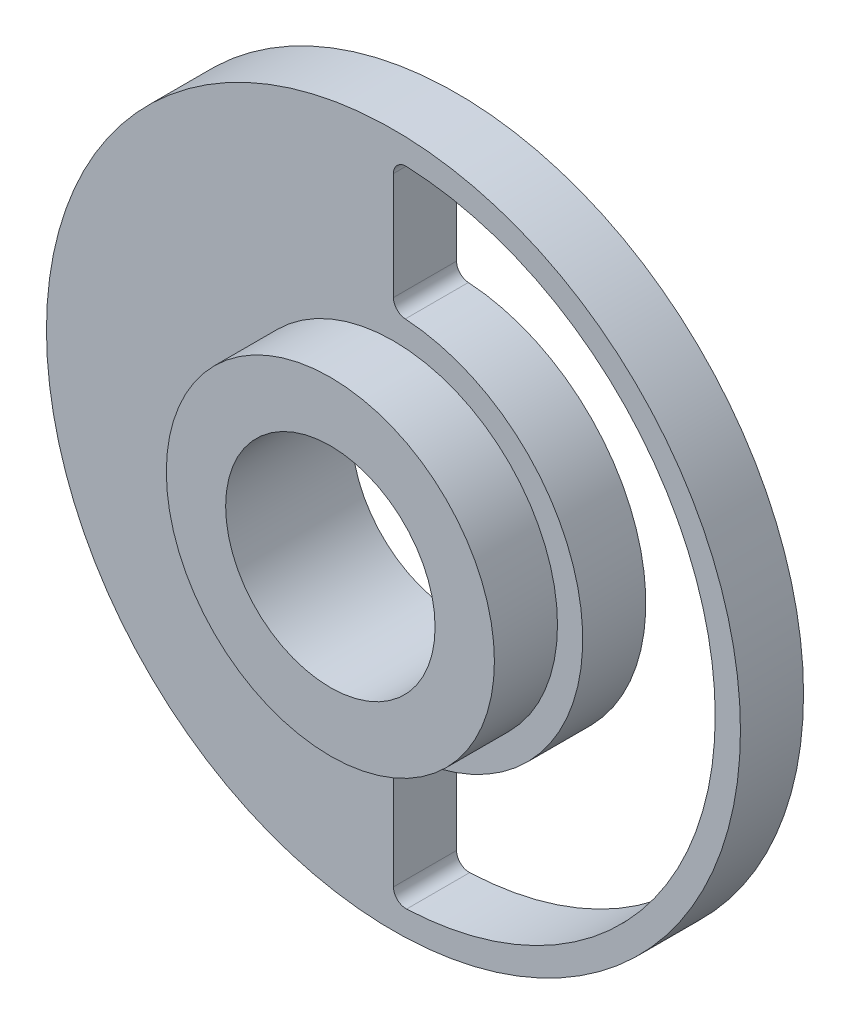
ISO-10303-21;
HEADER;
FILE_DESCRIPTION(('STEP AP214'),'2;1');
FILE_NAME('part.step','',(''),(''),'','','');
FILE_SCHEMA(('AUTOMOTIVE_DESIGN { 1 0 10303 214 1 1 1 1 }'));
ENDSEC;
DATA;
#1=APPLICATION_CONTEXT('core data for automotive mechanical design processes');
#2=APPLICATION_PROTOCOL_DEFINITION('international standard','automotive_design',2000,#1);
#3=PRODUCT_CONTEXT('',#1,'mechanical');
#4=PRODUCT('Part','Part','',(#3));
#5=PRODUCT_RELATED_PRODUCT_CATEGORY('part','',(#4));
#6=PRODUCT_DEFINITION_FORMATION('','',#4);
#7=PRODUCT_DEFINITION_CONTEXT('part definition',#1,'design');
#8=PRODUCT_DEFINITION('design','',#6,#7);
#9=PRODUCT_DEFINITION_SHAPE('','',#8);
#10=(LENGTH_UNIT() NAMED_UNIT(*) SI_UNIT(.MILLI.,.METRE.));
#11=(NAMED_UNIT(*) PLANE_ANGLE_UNIT() SI_UNIT($,.RADIAN.));
#12=(NAMED_UNIT(*) SI_UNIT($,.STERADIAN.) SOLID_ANGLE_UNIT());
#13=UNCERTAINTY_MEASURE_WITH_UNIT(LENGTH_MEASURE(1.E-05),#10,'distance_accuracy_value','');
#14=(GEOMETRIC_REPRESENTATION_CONTEXT(3) GLOBAL_UNCERTAINTY_ASSIGNED_CONTEXT((#13)) GLOBAL_UNIT_ASSIGNED_CONTEXT((#10,
#11,#12)) REPRESENTATION_CONTEXT('',''));
#15=CARTESIAN_POINT('',(0.,0.,0.));
#16=DIRECTION('',(0.,0.,1.));
#17=DIRECTION('',(1.,0.,0.));
#18=AXIS2_PLACEMENT_3D('',#15,#16,#17);
#19=CARTESIAN_POINT('',(0.,0.,2.5));
#20=DIRECTION('',(0.,0.,1.));
#21=DIRECTION('',(1.,0.,0.));
#22=AXIS2_PLACEMENT_3D('',#19,#20,#21);
#23=PLANE('',#22);
#24=CARTESIAN_POINT('',(0.,0.,2.5));
#25=DIRECTION('',(0.,0.,1.));
#26=DIRECTION('',(1.,0.,0.));
#27=AXIS2_PLACEMENT_3D('',#24,#25,#26);
#28=CIRCLE('',#27,7.5);
#29=CARTESIAN_POINT('',(0.46875,7.48533722937718,2.5));
#30=VERTEX_POINT('',#29);
#31=CARTESIAN_POINT('',(0.468749999999948,-7.48533722937718,2.5));
#32=VERTEX_POINT('',#31);
#33=EDGE_CURVE('E102',#30,#32,#28,.F.);
#34=ORIENTED_EDGE('',*,*,#33,.F.);
#35=CARTESIAN_POINT('',(0.5,7.98435971133565,2.5));
#36=DIRECTION('',(0.,0.,1.));
#37=DIRECTION('',(1.,0.,0.));
#38=AXIS2_PLACEMENT_3D('',#35,#36,#37);
#39=CIRCLE('',#38,0.5);
#40=CARTESIAN_POINT('',(0.,7.98435971133565,2.5));
#41=VERTEX_POINT('',#40);
#42=EDGE_CURVE('E113',#30,#41,#39,.F.);
#43=ORIENTED_EDGE('',*,*,#42,.T.);
#44=DIRECTION('',(0.,-1.,0.));
#45=VECTOR('',#44,1.);
#46=CARTESIAN_POINT('',(0.,0.,2.5));
#47=LINE('',#46,#45);
#48=CARTESIAN_POINT('',(0.,12.2397916648936,2.5));
#49=VERTEX_POINT('',#48);
#50=EDGE_CURVE('E167',#49,#41,#47,.T.);
#51=ORIENTED_EDGE('',*,*,#50,.F.);
#52=CARTESIAN_POINT('',(0.5,12.2397916648936,2.5));
#53=DIRECTION('',(0.,0.,1.));
#54=DIRECTION('',(1.,0.,0.));
#55=AXIS2_PLACEMENT_3D('',#52,#53,#54);
#56=CIRCLE('',#55,0.5);
#57=CARTESIAN_POINT('',(0.520408163265306,12.7393749981546,2.5));
#58=VERTEX_POINT('',#57);
#59=EDGE_CURVE('E11',#49,#58,#56,.F.);
#60=ORIENTED_EDGE('',*,*,#59,.T.);
#61=CARTESIAN_POINT('',(0.,0.,2.5));
#62=DIRECTION('',(0.,0.,1.));
#63=DIRECTION('',(1.,0.,0.));
#64=AXIS2_PLACEMENT_3D('',#61,#62,#63);
#65=CIRCLE('',#64,12.75);
#66=CARTESIAN_POINT('',(0.520408163265217,-12.7393749981546,2.5));
#67=VERTEX_POINT('',#66);
#68=EDGE_CURVE('E164',#58,#67,#65,.F.);
#69=ORIENTED_EDGE('',*,*,#68,.T.);
#70=CARTESIAN_POINT('',(0.499999999999915,-12.2397916648937,2.5));
#71=DIRECTION('',(0.,0.,1.));
#72=DIRECTION('',(1.,0.,0.));
#73=AXIS2_PLACEMENT_3D('',#70,#71,#72);
#74=CIRCLE('',#73,0.5);
#75=CARTESIAN_POINT('',(0.,-12.2397916648936,2.5));
#76=VERTEX_POINT('',#75);
#77=EDGE_CURVE('E124',#67,#76,#74,.F.);
#78=ORIENTED_EDGE('',*,*,#77,.T.);
#79=DIRECTION('',(0.,1.,0.));
#80=VECTOR('',#79,1.);
#81=CARTESIAN_POINT('',(0.,0.,2.5));
#82=LINE('',#81,#80);
#83=CARTESIAN_POINT('',(0.,-7.98435971133565,2.5));
#84=VERTEX_POINT('',#83);
#85=EDGE_CURVE('E119',#76,#84,#82,.T.);
#86=ORIENTED_EDGE('',*,*,#85,.T.);
#87=CARTESIAN_POINT('',(0.499999999999944,-7.98435971133566,2.5));
#88=DIRECTION('',(0.,0.,1.));
#89=DIRECTION('',(1.,0.,0.));
#90=AXIS2_PLACEMENT_3D('',#87,#88,#89);
#91=CIRCLE('',#90,0.5);
#92=EDGE_CURVE('E117',#84,#32,#91,.F.);
#93=ORIENTED_EDGE('',*,*,#92,.T.);
#94=EDGE_LOOP('',(#34,#43,#51,#60,#69,#78,#86,#93));
#95=FACE_BOUND('',#94,.T.);
#96=CARTESIAN_POINT('',(0.,0.,2.5));
#97=DIRECTION('',(0.,0.,1.));
#98=DIRECTION('',(1.,0.,0.));
#99=AXIS2_PLACEMENT_3D('',#96,#97,#98);
#100=CIRCLE('',#99,13.75);
#101=CARTESIAN_POINT('',(13.75,0.,2.5));
#102=VERTEX_POINT('',#101);
#103=EDGE_CURVE('E108',#102,#102,#100,.T.);
#104=ORIENTED_EDGE('',*,*,#103,.T.);
#105=EDGE_LOOP('',(#104));
#106=FACE_BOUND('',#105,.T.);
#107=CARTESIAN_POINT('',(0.,0.,2.5));
#108=DIRECTION('',(0.,0.,1.));
#109=DIRECTION('',(1.,0.,0.));
#110=AXIS2_PLACEMENT_3D('',#107,#108,#109);
#111=CIRCLE('',#110,6.5);
#112=CARTESIAN_POINT('',(6.5,0.,2.5));
#113=VERTEX_POINT('',#112);
#114=EDGE_CURVE('E156',#113,#113,#111,.T.);
#115=ORIENTED_EDGE('',*,*,#114,.F.);
#116=EDGE_LOOP('',(#115));
#117=FACE_BOUND('',#116,.T.);
#118=ADVANCED_FACE('F33',(#95,#106,#117),#23,.T.);
#119=CARTESIAN_POINT('',(0.,0.,0.));
#120=DIRECTION('',(0.,0.,1.));
#121=DIRECTION('',(1.,0.,0.));
#122=AXIS2_PLACEMENT_3D('',#119,#120,#121);
#123=PLANE('',#122);
#124=DIRECTION('',(0.,1.,0.));
#125=VECTOR('',#124,1.);
#126=CARTESIAN_POINT('',(0.,0.,0.));
#127=LINE('',#126,#125);
#128=CARTESIAN_POINT('',(0.,7.98435971133565,0.));
#129=VERTEX_POINT('',#128);
#130=CARTESIAN_POINT('',(0.,12.2397916648936,0.));
#131=VERTEX_POINT('',#130);
#132=EDGE_CURVE('E169',#129,#131,#127,.T.);
#133=ORIENTED_EDGE('',*,*,#132,.F.);
#134=CARTESIAN_POINT('',(0.5,7.98435971133565,0.));
#135=DIRECTION('',(0.,0.,1.));
#136=DIRECTION('',(1.,0.,0.));
#137=AXIS2_PLACEMENT_3D('',#134,#135,#136);
#138=CIRCLE('',#137,0.5);
#139=CARTESIAN_POINT('',(0.46875,7.48533722937718,0.));
#140=VERTEX_POINT('',#139);
#141=EDGE_CURVE('E55',#129,#140,#138,.T.);
#142=ORIENTED_EDGE('',*,*,#141,.T.);
#143=CARTESIAN_POINT('',(0.,0.,0.));
#144=DIRECTION('',(0.,0.,1.));
#145=DIRECTION('',(1.,0.,0.));
#146=AXIS2_PLACEMENT_3D('',#143,#144,#145);
#147=CIRCLE('',#146,7.5);
#148=CARTESIAN_POINT('',(0.468749999999948,-7.48533722937718,0.));
#149=VERTEX_POINT('',#148);
#150=EDGE_CURVE('E105',#149,#140,#147,.T.);
#151=ORIENTED_EDGE('',*,*,#150,.F.);
#152=CARTESIAN_POINT('',(0.499999999999944,-7.98435971133566,0.));
#153=DIRECTION('',(0.,0.,1.));
#154=DIRECTION('',(1.,0.,0.));
#155=AXIS2_PLACEMENT_3D('',#152,#153,#154);
#156=CIRCLE('',#155,0.5);
#157=CARTESIAN_POINT('',(0.,-7.98435971133565,0.));
#158=VERTEX_POINT('',#157);
#159=EDGE_CURVE('E131',#149,#158,#156,.T.);
#160=ORIENTED_EDGE('',*,*,#159,.T.);
#161=DIRECTION('',(0.,-1.,0.));
#162=VECTOR('',#161,1.);
#163=CARTESIAN_POINT('',(0.,0.,0.));
#164=LINE('',#163,#162);
#165=CARTESIAN_POINT('',(0.,-12.2397916648936,0.));
#166=VERTEX_POINT('',#165);
#167=EDGE_CURVE('E173',#158,#166,#164,.T.);
#168=ORIENTED_EDGE('',*,*,#167,.T.);
#169=CARTESIAN_POINT('',(0.499999999999915,-12.2397916648937,0.));
#170=DIRECTION('',(0.,0.,1.));
#171=DIRECTION('',(1.,0.,0.));
#172=AXIS2_PLACEMENT_3D('',#169,#170,#171);
#173=CIRCLE('',#172,0.5);
#174=CARTESIAN_POINT('',(0.520408163265217,-12.7393749981546,0.));
#175=VERTEX_POINT('',#174);
#176=EDGE_CURVE('E128',#166,#175,#173,.T.);
#177=ORIENTED_EDGE('',*,*,#176,.T.);
#178=CARTESIAN_POINT('',(0.,0.,0.));
#179=DIRECTION('',(0.,0.,1.));
#180=DIRECTION('',(1.,0.,0.));
#181=AXIS2_PLACEMENT_3D('',#178,#179,#180);
#182=CIRCLE('',#181,12.75);
#183=CARTESIAN_POINT('',(0.520408163265306,12.7393749981546,0.));
#184=VERTEX_POINT('',#183);
#185=EDGE_CURVE('E171',#175,#184,#182,.T.);
#186=ORIENTED_EDGE('',*,*,#185,.T.);
#187=CARTESIAN_POINT('',(0.5,12.2397916648936,0.));
#188=DIRECTION('',(0.,0.,1.));
#189=DIRECTION('',(1.,0.,0.));
#190=AXIS2_PLACEMENT_3D('',#187,#188,#189);
#191=CIRCLE('',#190,0.5);
#192=EDGE_CURVE('E41',#184,#131,#191,.T.);
#193=ORIENTED_EDGE('',*,*,#192,.T.);
#194=EDGE_LOOP('',(#133,#142,#151,#160,#168,#177,#186,#193));
#195=FACE_BOUND('',#194,.T.);
#196=CARTESIAN_POINT('',(0.,0.,0.));
#197=DIRECTION('',(0.,0.,1.));
#198=DIRECTION('',(1.,0.,0.));
#199=AXIS2_PLACEMENT_3D('',#196,#197,#198);
#200=CIRCLE('',#199,13.75);
#201=CARTESIAN_POINT('',(13.75,0.,0.));
#202=VERTEX_POINT('',#201);
#203=EDGE_CURVE('E147',#202,#202,#200,.T.);
#204=ORIENTED_EDGE('',*,*,#203,.F.);
#205=EDGE_LOOP('',(#204));
#206=FACE_BOUND('',#205,.T.);
#207=CARTESIAN_POINT('',(0.,0.,0.));
#208=DIRECTION('',(0.,0.,1.));
#209=DIRECTION('',(1.,0.,0.));
#210=AXIS2_PLACEMENT_3D('',#207,#208,#209);
#211=CIRCLE('',#210,4.15);
#212=CARTESIAN_POINT('',(4.15,0.,0.));
#213=VERTEX_POINT('',#212);
#214=EDGE_CURVE('E150',#213,#213,#211,.T.);
#215=ORIENTED_EDGE('',*,*,#214,.T.);
#216=EDGE_LOOP('',(#215));
#217=FACE_BOUND('',#216,.T.);
#218=ADVANCED_FACE('F177',(#195,#206,#217),#123,.F.);
#219=CARTESIAN_POINT('',(0.,0.,2.5));
#220=DIRECTION('',(0.,0.,-1.));
#221=DIRECTION('',(-1.,0.,0.));
#222=AXIS2_PLACEMENT_3D('',#219,#220,#221);
#223=CYLINDRICAL_SURFACE('',#222,13.75);
#224=ORIENTED_EDGE('',*,*,#103,.F.);
#225=EDGE_LOOP('',(#224));
#226=FACE_BOUND('',#225,.T.);
#227=ORIENTED_EDGE('',*,*,#203,.T.);
#228=EDGE_LOOP('',(#227));
#229=FACE_BOUND('',#228,.T.);
#230=ADVANCED_FACE('F213',(#226,#229),#223,.T.);
#231=CARTESIAN_POINT('',(0.,0.,2.5));
#232=DIRECTION('',(0.,0.,-1.));
#233=DIRECTION('',(-1.,0.,0.));
#234=AXIS2_PLACEMENT_3D('',#231,#232,#233);
#235=CYLINDRICAL_SURFACE('',#234,4.15);
#236=ORIENTED_EDGE('',*,*,#214,.F.);
#237=EDGE_LOOP('',(#236));
#238=FACE_BOUND('',#237,.T.);
#239=CARTESIAN_POINT('',(0.,0.,5.));
#240=DIRECTION('',(0.,0.,1.));
#241=DIRECTION('',(1.,0.,0.));
#242=AXIS2_PLACEMENT_3D('',#239,#240,#241);
#243=CIRCLE('',#242,4.15);
#244=CARTESIAN_POINT('',(4.15,0.,5.));
#245=VERTEX_POINT('',#244);
#246=EDGE_CURVE('E118',#245,#245,#243,.T.);
#247=ORIENTED_EDGE('',*,*,#246,.T.);
#248=EDGE_LOOP('',(#247));
#249=FACE_BOUND('',#248,.T.);
#250=ADVANCED_FACE('F216',(#238,#249),#235,.F.);
#251=CARTESIAN_POINT('',(0.,0.,5.));
#252=DIRECTION('',(0.,0.,1.));
#253=DIRECTION('',(1.,0.,0.));
#254=AXIS2_PLACEMENT_3D('',#251,#252,#253);
#255=PLANE('',#254);
#256=CARTESIAN_POINT('',(0.,0.,5.));
#257=DIRECTION('',(0.,0.,1.));
#258=DIRECTION('',(1.,0.,0.));
#259=AXIS2_PLACEMENT_3D('',#256,#257,#258);
#260=CIRCLE('',#259,6.5);
#261=CARTESIAN_POINT('',(6.5,0.,5.));
#262=VERTEX_POINT('',#261);
#263=EDGE_CURVE('E155',#262,#262,#260,.T.);
#264=ORIENTED_EDGE('',*,*,#263,.T.);
#265=EDGE_LOOP('',(#264));
#266=FACE_BOUND('',#265,.T.);
#267=ORIENTED_EDGE('',*,*,#246,.F.);
#268=EDGE_LOOP('',(#267));
#269=FACE_BOUND('',#268,.T.);
#270=ADVANCED_FACE('F225',(#266,#269),#255,.T.);
#271=CARTESIAN_POINT('',(0.,0.,5.));
#272=DIRECTION('',(0.,0.,-1.));
#273=DIRECTION('',(-1.,0.,0.));
#274=AXIS2_PLACEMENT_3D('',#271,#272,#273);
#275=CYLINDRICAL_SURFACE('',#274,6.5);
#276=ORIENTED_EDGE('',*,*,#263,.F.);
#277=EDGE_LOOP('',(#276));
#278=FACE_BOUND('',#277,.T.);
#279=ORIENTED_EDGE('',*,*,#114,.T.);
#280=EDGE_LOOP('',(#279));
#281=FACE_BOUND('',#280,.T.);
#282=ADVANCED_FACE('F236',(#278,#281),#275,.T.);
#283=CARTESIAN_POINT('',(0.,0.,5.));
#284=DIRECTION('',(0.,0.,-1.));
#285=DIRECTION('',(-1.,0.,0.));
#286=AXIS2_PLACEMENT_3D('',#283,#284,#285);
#287=CYLINDRICAL_SURFACE('',#286,7.5);
#288=ORIENTED_EDGE('',*,*,#33,.T.);
#289=DIRECTION('',(0.,0.,-1.));
#290=VECTOR('',#289,1.);
#291=CARTESIAN_POINT('',(0.468749999999948,-7.48533722937718,5.));
#292=LINE('',#291,#290);
#293=EDGE_CURVE('E107',#32,#149,#292,.T.);
#294=ORIENTED_EDGE('',*,*,#293,.T.);
#295=ORIENTED_EDGE('',*,*,#150,.T.);
#296=DIRECTION('',(0.,0.,-1.));
#297=VECTOR('',#296,1.);
#298=CARTESIAN_POINT('',(0.46875,7.48533722937718,5.));
#299=LINE('',#298,#297);
#300=EDGE_CURVE('E98',#140,#30,#299,.F.);
#301=ORIENTED_EDGE('',*,*,#300,.T.);
#302=EDGE_LOOP('',(#288,#294,#295,#301));
#303=FACE_BOUND('',#302,.T.);
#304=ADVANCED_FACE('F100',(#303),#287,.T.);
#305=CARTESIAN_POINT('',(0.,0.,5.));
#306=DIRECTION('',(1.,0.,0.));
#307=DIRECTION('',(0.,1.,0.));
#308=AXIS2_PLACEMENT_3D('',#305,#306,#307);
#309=PLANE('',#308);
#310=ORIENTED_EDGE('',*,*,#167,.F.);
#311=DIRECTION('',(0.,0.,-1.));
#312=VECTOR('',#311,1.);
#313=CARTESIAN_POINT('',(0.,-7.98435971133565,5.));
#314=LINE('',#313,#312);
#315=EDGE_CURVE('E141',#158,#84,#314,.F.);
#316=ORIENTED_EDGE('',*,*,#315,.T.);
#317=ORIENTED_EDGE('',*,*,#85,.F.);
#318=DIRECTION('',(0.,0.,1.));
#319=VECTOR('',#318,1.);
#320=CARTESIAN_POINT('',(0.,-12.2397916648936,0.));
#321=LINE('',#320,#319);
#322=EDGE_CURVE('E143',#76,#166,#321,.F.);
#323=ORIENTED_EDGE('',*,*,#322,.T.);
#324=EDGE_LOOP('',(#310,#316,#317,#323));
#325=FACE_BOUND('',#324,.T.);
#326=ADVANCED_FACE('F182',(#325),#309,.T.);
#327=CARTESIAN_POINT('',(0.,0.,5.));
#328=DIRECTION('',(0.,0.,-1.));
#329=DIRECTION('',(-1.,0.,0.));
#330=AXIS2_PLACEMENT_3D('',#327,#328,#329);
#331=CYLINDRICAL_SURFACE('',#330,12.75);
#332=ORIENTED_EDGE('',*,*,#185,.F.);
#333=DIRECTION('',(0.,0.,-1.));
#334=VECTOR('',#333,1.);
#335=CARTESIAN_POINT('',(0.520408163265217,-12.7393749981546,5.));
#336=LINE('',#335,#334);
#337=EDGE_CURVE('E136',#175,#67,#336,.F.);
#338=ORIENTED_EDGE('',*,*,#337,.T.);
#339=ORIENTED_EDGE('',*,*,#68,.F.);
#340=DIRECTION('',(0.,0.,-1.));
#341=VECTOR('',#340,1.);
#342=CARTESIAN_POINT('',(0.520408163265306,12.7393749981546,5.));
#343=LINE('',#342,#341);
#344=EDGE_CURVE('E138',#58,#184,#343,.T.);
#345=ORIENTED_EDGE('',*,*,#344,.T.);
#346=EDGE_LOOP('',(#332,#338,#339,#345));
#347=FACE_BOUND('',#346,.T.);
#348=ADVANCED_FACE('F196',(#347),#331,.F.);
#349=CARTESIAN_POINT('',(0.,0.,5.));
#350=DIRECTION('',(-1.,0.,0.));
#351=DIRECTION('',(0.,0.,1.));
#352=AXIS2_PLACEMENT_3D('',#349,#350,#351);
#353=PLANE('',#352);
#354=ORIENTED_EDGE('',*,*,#50,.T.);
#355=DIRECTION('',(0.,0.,1.));
#356=VECTOR('',#355,1.);
#357=CARTESIAN_POINT('',(0.,7.98435971133565,0.));
#358=LINE('',#357,#356);
#359=EDGE_CURVE('E122',#41,#129,#358,.F.);
#360=ORIENTED_EDGE('',*,*,#359,.T.);
#361=ORIENTED_EDGE('',*,*,#132,.T.);
#362=DIRECTION('',(0.,0.,-1.));
#363=VECTOR('',#362,1.);
#364=CARTESIAN_POINT('',(0.,12.2397916648936,5.));
#365=LINE('',#364,#363);
#366=EDGE_CURVE('E134',#131,#49,#365,.F.);
#367=ORIENTED_EDGE('',*,*,#366,.T.);
#368=EDGE_LOOP('',(#354,#360,#361,#367));
#369=FACE_BOUND('',#368,.T.);
#370=ADVANCED_FACE('F189',(#369),#353,.F.);
#371=CARTESIAN_POINT('',(0.499999999999944,-7.98435971133566,5.));
#372=DIRECTION('',(0.,0.,-1.));
#373=DIRECTION('',(-1.,0.,0.));
#374=AXIS2_PLACEMENT_3D('',#371,#372,#373);
#375=CYLINDRICAL_SURFACE('',#374,0.5);
#376=ORIENTED_EDGE('',*,*,#92,.F.);
#377=ORIENTED_EDGE('',*,*,#315,.F.);
#378=ORIENTED_EDGE('',*,*,#159,.F.);
#379=ORIENTED_EDGE('',*,*,#293,.F.);
#380=EDGE_LOOP('',(#376,#377,#378,#379));
#381=FACE_BOUND('',#380,.T.);
#382=ADVANCED_FACE('F186',(#381),#375,.F.);
#383=CARTESIAN_POINT('',(0.499999999999915,-12.2397916648937,5.));
#384=DIRECTION('',(0.,0.,-1.));
#385=DIRECTION('',(-1.,0.,0.));
#386=AXIS2_PLACEMENT_3D('',#383,#384,#385);
#387=CYLINDRICAL_SURFACE('',#386,0.5);
#388=ORIENTED_EDGE('',*,*,#77,.F.);
#389=ORIENTED_EDGE('',*,*,#337,.F.);
#390=ORIENTED_EDGE('',*,*,#176,.F.);
#391=ORIENTED_EDGE('',*,*,#322,.F.);
#392=EDGE_LOOP('',(#388,#389,#390,#391));
#393=FACE_BOUND('',#392,.T.);
#394=ADVANCED_FACE('F199',(#393),#387,.F.);
#395=CARTESIAN_POINT('',(0.5,7.98435971133565,5.));
#396=DIRECTION('',(0.,0.,-1.));
#397=DIRECTION('',(-1.,0.,0.));
#398=AXIS2_PLACEMENT_3D('',#395,#396,#397);
#399=CYLINDRICAL_SURFACE('',#398,0.5);
#400=ORIENTED_EDGE('',*,*,#42,.F.);
#401=ORIENTED_EDGE('',*,*,#300,.F.);
#402=ORIENTED_EDGE('',*,*,#141,.F.);
#403=ORIENTED_EDGE('',*,*,#359,.F.);
#404=EDGE_LOOP('',(#400,#401,#402,#403));
#405=FACE_BOUND('',#404,.T.);
#406=ADVANCED_FACE('F121',(#405),#399,.F.);
#407=CARTESIAN_POINT('',(0.5,12.2397916648936,5.));
#408=DIRECTION('',(0.,0.,-1.));
#409=DIRECTION('',(-1.,0.,0.));
#410=AXIS2_PLACEMENT_3D('',#407,#408,#409);
#411=CYLINDRICAL_SURFACE('',#410,0.5);
#412=ORIENTED_EDGE('',*,*,#59,.F.);
#413=ORIENTED_EDGE('',*,*,#366,.F.);
#414=ORIENTED_EDGE('',*,*,#192,.F.);
#415=ORIENTED_EDGE('',*,*,#344,.F.);
#416=EDGE_LOOP('',(#412,#413,#414,#415));
#417=FACE_BOUND('',#416,.T.);
#418=ADVANCED_FACE('F35',(#417),#411,.F.);
#419=CLOSED_SHELL('',(#118,#218,#230,#250,#270,#282,#304,#326,#348,#370,#382,#394,#406,#418));
#420=MANIFOLD_SOLID_BREP('B2',#419);
#421=ADVANCED_BREP_SHAPE_REPRESENTATION('',(#18,#420),#14);
#422=SHAPE_DEFINITION_REPRESENTATION(#9,#421);
ENDSEC;
END-ISO-10303-21;
